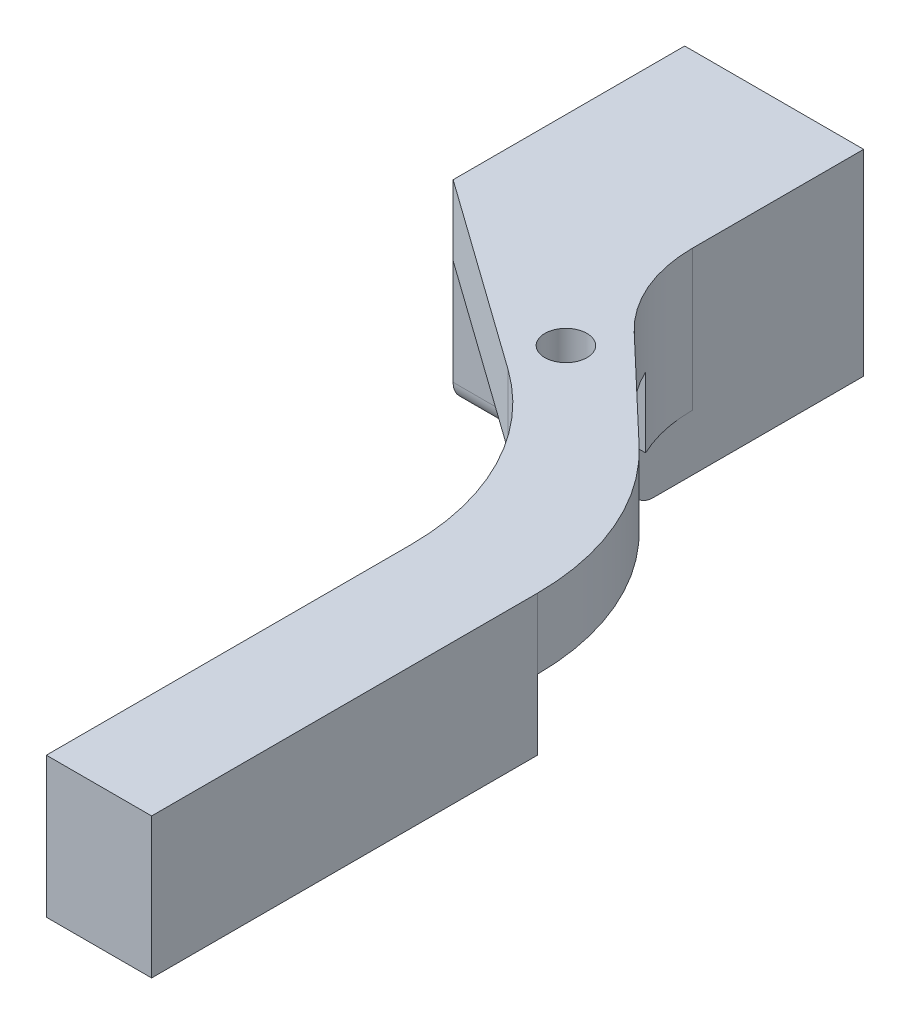
ISO-10303-21;
HEADER;
FILE_DESCRIPTION(('STEP AP214'),'2;1');
FILE_NAME('part.step','',(''),(''),'','','');
FILE_SCHEMA(('AUTOMOTIVE_DESIGN { 1 0 10303 214 1 1 1 1 }'));
ENDSEC;
DATA;
#1=APPLICATION_CONTEXT('core data for automotive mechanical design processes');
#2=APPLICATION_PROTOCOL_DEFINITION('international standard','automotive_design',2000,#1);
#3=PRODUCT_CONTEXT('',#1,'mechanical');
#4=PRODUCT('Part','Part','',(#3));
#5=PRODUCT_RELATED_PRODUCT_CATEGORY('part','',(#4));
#6=PRODUCT_DEFINITION_FORMATION('','',#4);
#7=PRODUCT_DEFINITION_CONTEXT('part definition',#1,'design');
#8=PRODUCT_DEFINITION('design','',#6,#7);
#9=PRODUCT_DEFINITION_SHAPE('','',#8);
#10=(LENGTH_UNIT() NAMED_UNIT(*) SI_UNIT(.MILLI.,.METRE.));
#11=(NAMED_UNIT(*) PLANE_ANGLE_UNIT() SI_UNIT($,.RADIAN.));
#12=(NAMED_UNIT(*) SI_UNIT($,.STERADIAN.) SOLID_ANGLE_UNIT());
#13=UNCERTAINTY_MEASURE_WITH_UNIT(LENGTH_MEASURE(1.E-05),#10,'distance_accuracy_value','');
#14=(GEOMETRIC_REPRESENTATION_CONTEXT(3) GLOBAL_UNCERTAINTY_ASSIGNED_CONTEXT((#13)) GLOBAL_UNIT_ASSIGNED_CONTEXT((#10,
#11,#12)) REPRESENTATION_CONTEXT('',''));
#15=CARTESIAN_POINT('',(0.,0.,0.));
#16=DIRECTION('',(0.,0.,1.));
#17=DIRECTION('',(1.,0.,0.));
#18=AXIS2_PLACEMENT_3D('',#15,#16,#17);
#19=CARTESIAN_POINT('',(0.,-6.,0.));
#20=DIRECTION('',(0.,1.,0.));
#21=DIRECTION('',(0.,0.,1.));
#22=AXIS2_PLACEMENT_3D('',#19,#20,#21);
#23=PLANE('',#22);
#24=CARTESIAN_POINT('',(-9.21544700565424,-6.,81.0202352893997));
#25=DIRECTION('',(0.,1.,0.));
#26=DIRECTION('',(0.,0.,1.));
#27=AXIS2_PLACEMENT_3D('',#24,#25,#26);
#28=CIRCLE('',#27,35.);
#29=CARTESIAN_POINT('',(25.7845529943458,-6.,81.0202352893997));
#30=VERTEX_POINT('',#29);
#31=CARTESIAN_POINT('',(25.6549783249145,-6.,78.0113422595251));
#32=VERTEX_POINT('',#31);
#33=EDGE_CURVE('E324',#30,#32,#28,.T.);
#34=ORIENTED_EDGE('',*,*,#33,.T.);
#35=DIRECTION('',(-1.,0.,0.));
#36=VECTOR('',#35,1.);
#37=CARTESIAN_POINT('',(-16.25,-6.,78.0113422595251));
#38=LINE('',#37,#36);
#39=CARTESIAN_POINT('',(40.7845529943458,-6.,78.0113422595251));
#40=VERTEX_POINT('',#39);
#41=EDGE_CURVE('E209',#40,#32,#38,.T.);
#42=ORIENTED_EDGE('',*,*,#41,.F.);
#43=DIRECTION('',(0.,0.,-1.));
#44=VECTOR('',#43,1.);
#45=CARTESIAN_POINT('',(40.7845529943458,-6.,133.));
#46=LINE('',#45,#44);
#47=CARTESIAN_POINT('',(40.7845529943458,-6.,133.));
#48=VERTEX_POINT('',#47);
#49=EDGE_CURVE('E371',#48,#40,#46,.T.);
#50=ORIENTED_EDGE('',*,*,#49,.F.);
#51=DIRECTION('',(1.,0.,0.));
#52=VECTOR('',#51,1.);
#53=CARTESIAN_POINT('',(25.7845529943458,-6.,133.));
#54=LINE('',#53,#52);
#55=CARTESIAN_POINT('',(25.7845529943458,-6.,133.));
#56=VERTEX_POINT('',#55);
#57=EDGE_CURVE('E394',#56,#48,#54,.T.);
#58=ORIENTED_EDGE('',*,*,#57,.F.);
#59=DIRECTION('',(0.,0.,1.));
#60=VECTOR('',#59,1.);
#61=CARTESIAN_POINT('',(25.7845529943458,-6.,63.));
#62=LINE('',#61,#60);
#63=EDGE_CURVE('E377',#30,#56,#62,.T.);
#64=ORIENTED_EDGE('',*,*,#63,.F.);
#65=EDGE_LOOP('',(#34,#42,#50,#58,#64));
#66=FACE_BOUND('',#65,.T.);
#67=ADVANCED_FACE('F38',(#66),#23,.F.);
#68=CARTESIAN_POINT('',(0.,0.,0.));
#69=DIRECTION('',(0.,0.,-1.));
#70=DIRECTION('',(-1.,0.,0.));
#71=AXIS2_PLACEMENT_3D('',#68,#69,#70);
#72=PLANE('',#71);
#73=DIRECTION('',(0.,1.,0.));
#74=VECTOR('',#73,1.);
#75=CARTESIAN_POINT('',(9.25,-14.,0.));
#76=LINE('',#75,#74);
#77=CARTESIAN_POINT('',(9.25,-14.,0.));
#78=VERTEX_POINT('',#77);
#79=CARTESIAN_POINT('',(9.25,14.,0.));
#80=VERTEX_POINT('',#79);
#81=EDGE_CURVE('E265',#78,#80,#76,.T.);
#82=ORIENTED_EDGE('',*,*,#81,.F.);
#83=DIRECTION('',(1.,0.,0.));
#84=VECTOR('',#83,1.);
#85=CARTESIAN_POINT('',(-16.25,-14.,0.));
#86=LINE('',#85,#84);
#87=CARTESIAN_POINT('',(-16.25,-14.,0.));
#88=VERTEX_POINT('',#87);
#89=EDGE_CURVE('E276',#88,#78,#86,.T.);
#90=ORIENTED_EDGE('',*,*,#89,.F.);
#91=DIRECTION('',(0.,-1.,0.));
#92=VECTOR('',#91,1.);
#93=CARTESIAN_POINT('',(-16.25,-14.,0.));
#94=LINE('',#93,#92);
#95=CARTESIAN_POINT('',(-16.25,14.,0.));
#96=VERTEX_POINT('',#95);
#97=EDGE_CURVE('E272',#96,#88,#94,.T.);
#98=ORIENTED_EDGE('',*,*,#97,.F.);
#99=DIRECTION('',(-1.,0.,0.));
#100=VECTOR('',#99,1.);
#101=CARTESIAN_POINT('',(-16.25,14.,0.));
#102=LINE('',#101,#100);
#103=EDGE_CURVE('E269',#80,#96,#102,.T.);
#104=ORIENTED_EDGE('',*,*,#103,.F.);
#105=EDGE_LOOP('',(#82,#90,#98,#104));
#106=FACE_BOUND('',#105,.T.);
#107=DIRECTION('',(1.,0.,0.));
#108=VECTOR('',#107,1.);
#109=CARTESIAN_POINT('',(-6.25,-11.3,0.));
#110=LINE('',#109,#108);
#111=CARTESIAN_POINT('',(-6.25,-11.3,0.));
#112=VERTEX_POINT('',#111);
#113=CARTESIAN_POINT('',(6.25,-11.3,0.));
#114=VERTEX_POINT('',#113);
#115=EDGE_CURVE('E229',#112,#114,#110,.T.);
#116=ORIENTED_EDGE('',*,*,#115,.T.);
#117=DIRECTION('',(0.,1.,0.));
#118=VECTOR('',#117,1.);
#119=CARTESIAN_POINT('',(6.25,-11.3,0.));
#120=LINE('',#119,#118);
#121=CARTESIAN_POINT('',(6.25,11.3,0.));
#122=VERTEX_POINT('',#121);
#123=EDGE_CURVE('E216',#114,#122,#120,.T.);
#124=ORIENTED_EDGE('',*,*,#123,.T.);
#125=DIRECTION('',(-1.,0.,0.));
#126=VECTOR('',#125,1.);
#127=CARTESIAN_POINT('',(-6.25,11.3,0.));
#128=LINE('',#127,#126);
#129=CARTESIAN_POINT('',(-6.25,11.3,0.));
#130=VERTEX_POINT('',#129);
#131=EDGE_CURVE('E219',#122,#130,#128,.T.);
#132=ORIENTED_EDGE('',*,*,#131,.T.);
#133=DIRECTION('',(0.,-1.,0.));
#134=VECTOR('',#133,1.);
#135=CARTESIAN_POINT('',(-6.25,-11.3,0.));
#136=LINE('',#135,#134);
#137=EDGE_CURVE('E245',#130,#112,#136,.T.);
#138=ORIENTED_EDGE('',*,*,#137,.T.);
#139=EDGE_LOOP('',(#116,#124,#132,#138));
#140=FACE_BOUND('',#139,.T.);
#141=ADVANCED_FACE('F432',(#106,#140),#72,.T.);
#142=CARTESIAN_POINT('',(9.25,-14.,30.));
#143=DIRECTION('',(-1.,0.,0.));
#144=DIRECTION('',(0.,0.,1.));
#145=AXIS2_PLACEMENT_3D('',#142,#143,#144);
#146=PLANE('',#145);
#147=DIRECTION('',(0.,0.,-1.));
#148=VECTOR('',#147,1.);
#149=CARTESIAN_POINT('',(9.25,14.,30.));
#150=LINE('',#149,#148);
#151=CARTESIAN_POINT('',(9.25,14.,24.4220901374142));
#152=VERTEX_POINT('',#151);
#153=EDGE_CURVE('E289',#152,#80,#150,.T.);
#154=ORIENTED_EDGE('',*,*,#153,.F.);
#155=DIRECTION('',(0.,1.,0.));
#156=VECTOR('',#155,1.);
#157=CARTESIAN_POINT('',(9.25,-14.,24.4220901374142));
#158=LINE('',#157,#156);
#159=CARTESIAN_POINT('',(9.25,-6.,24.4220901374142));
#160=VERTEX_POINT('',#159);
#161=EDGE_CURVE('E333',#152,#160,#158,.F.);
#162=ORIENTED_EDGE('',*,*,#161,.T.);
#163=DIRECTION('',(0.,0.,1.));
#164=VECTOR('',#163,1.);
#165=CARTESIAN_POINT('',(9.25,-6.,0.));
#166=LINE('',#165,#164);
#167=CARTESIAN_POINT('',(9.25,-6.,33.));
#168=VERTEX_POINT('',#167);
#169=EDGE_CURVE('E62',#160,#168,#166,.T.);
#170=ORIENTED_EDGE('',*,*,#169,.T.);
#171=DIRECTION('',(0.,1.,0.));
#172=VECTOR('',#171,1.);
#173=CARTESIAN_POINT('',(9.25,14.,33.));
#174=LINE('',#173,#172);
#175=CARTESIAN_POINT('',(9.25,-11.,33.));
#176=VERTEX_POINT('',#175);
#177=EDGE_CURVE('E190',#176,#168,#174,.T.);
#178=ORIENTED_EDGE('',*,*,#177,.F.);
#179=CARTESIAN_POINT('',(9.25,-11.,30.));
#180=DIRECTION('',(-1.,0.,0.));
#181=DIRECTION('',(0.,0.,1.));
#182=AXIS2_PLACEMENT_3D('',#179,#180,#181);
#183=CIRCLE('',#182,3.);
#184=CARTESIAN_POINT('',(9.25,-14.,30.));
#185=VERTEX_POINT('',#184);
#186=EDGE_CURVE('E295',#176,#185,#183,.F.);
#187=ORIENTED_EDGE('',*,*,#186,.T.);
#188=DIRECTION('',(0.,0.,-1.));
#189=VECTOR('',#188,1.);
#190=CARTESIAN_POINT('',(9.25,-14.,30.));
#191=LINE('',#190,#189);
#192=EDGE_CURVE('E280',#185,#78,#191,.T.);
#193=ORIENTED_EDGE('',*,*,#192,.T.);
#194=ORIENTED_EDGE('',*,*,#81,.T.);
#195=EDGE_LOOP('',(#154,#162,#170,#178,#187,#193,#194));
#196=FACE_BOUND('',#195,.T.);
#197=ADVANCED_FACE('F359',(#196),#146,.F.);
#198=CARTESIAN_POINT('',(-16.25,14.,30.));
#199=DIRECTION('',(0.,-1.,0.));
#200=DIRECTION('',(0.,0.,-1.));
#201=AXIS2_PLACEMENT_3D('',#198,#199,#200);
#202=PLANE('',#201);
#203=CARTESIAN_POINT('',(12.25,14.,45.4260665059655));
#204=DIRECTION('',(0.,1.,0.));
#205=DIRECTION('',(0.,0.,1.));
#206=AXIS2_PLACEMENT_3D('',#203,#204,#205);
#207=CIRCLE('',#206,3.);
#208=CARTESIAN_POINT('',(12.25,14.,48.4260665059655));
#209=VERTEX_POINT('',#208);
#210=EDGE_CURVE('E202',#209,#209,#207,.T.);
#211=ORIENTED_EDGE('',*,*,#210,.F.);
#212=EDGE_LOOP('',(#211));
#213=FACE_BOUND('',#212,.T.);
#214=DIRECTION('',(0.,0.,-1.));
#215=VECTOR('',#214,1.);
#216=CARTESIAN_POINT('',(40.7845529943458,14.,133.));
#217=LINE('',#216,#215);
#218=CARTESIAN_POINT('',(40.7845529943458,14.,133.));
#219=VERTEX_POINT('',#218);
#220=CARTESIAN_POINT('',(40.7845529943458,14.,78.0113422595251));
#221=VERTEX_POINT('',#220);
#222=EDGE_CURVE('E378',#219,#221,#217,.T.);
#223=ORIENTED_EDGE('',*,*,#222,.T.);
#224=CARTESIAN_POINT('',(5.78455299434576,14.,78.0113422595251));
#225=DIRECTION('',(0.,-1.,0.));
#226=DIRECTION('',(0.,0.,-1.));
#227=AXIS2_PLACEMENT_3D('',#224,#225,#226);
#228=CIRCLE('',#227,35.);
#229=CARTESIAN_POINT('',(29.9086042935572,14.,52.6533031217484));
#230=VERTEX_POINT('',#229);
#231=EDGE_CURVE('E308',#221,#230,#228,.F.);
#232=ORIENTED_EDGE('',*,*,#231,.T.);
#233=DIRECTION('',(-0.724515403936476,0.,-0.689258608548899));
#234=VECTOR('',#233,1.);
#235=CARTESIAN_POINT('',(9.25,14.,33.));
#236=LINE('',#235,#234);
#237=CARTESIAN_POINT('',(15.464827829022,14.,38.9123982161438));
#238=VERTEX_POINT('',#237);
#239=EDGE_CURVE('E373',#230,#238,#236,.T.);
#240=ORIENTED_EDGE('',*,*,#239,.T.);
#241=CARTESIAN_POINT('',(29.25,14.,24.4220901374142));
#242=DIRECTION('',(0.,-1.,0.));
#243=DIRECTION('',(0.,0.,-1.));
#244=AXIS2_PLACEMENT_3D('',#241,#242,#243);
#245=CIRCLE('',#244,20.);
#246=EDGE_CURVE('E336',#238,#152,#245,.T.);
#247=ORIENTED_EDGE('',*,*,#246,.T.);
#248=ORIENTED_EDGE('',*,*,#153,.T.);
#249=ORIENTED_EDGE('',*,*,#103,.T.);
#250=DIRECTION('',(0.,0.,-1.));
#251=VECTOR('',#250,1.);
#252=CARTESIAN_POINT('',(-16.25,14.,30.));
#253=LINE('',#252,#251);
#254=CARTESIAN_POINT('',(-16.25,14.,33.));
#255=VERTEX_POINT('',#254);
#256=EDGE_CURVE('E286',#255,#96,#253,.T.);
#257=ORIENTED_EDGE('',*,*,#256,.F.);
#258=DIRECTION('',(0.813959452282594,0.,0.580921690109622));
#259=VECTOR('',#258,1.);
#260=CARTESIAN_POINT('',(-16.25,14.,33.));
#261=LINE('',#260,#259);
#262=CARTESIAN_POINT('',(11.1168121481825,14.,52.5316544595089));
#263=VERTEX_POINT('',#262);
#264=EDGE_CURVE('E213',#255,#263,#261,.T.);
#265=ORIENTED_EDGE('',*,*,#264,.T.);
#266=CARTESIAN_POINT('',(-9.21544700565424,14.,81.0202352893997));
#267=DIRECTION('',(0.,-1.,0.));
#268=DIRECTION('',(0.,0.,-1.));
#269=AXIS2_PLACEMENT_3D('',#266,#267,#268);
#270=CIRCLE('',#269,35.);
#271=CARTESIAN_POINT('',(25.7845529943458,14.,81.0202352893997));
#272=VERTEX_POINT('',#271);
#273=EDGE_CURVE('E321',#263,#272,#270,.T.);
#274=ORIENTED_EDGE('',*,*,#273,.T.);
#275=DIRECTION('',(0.,0.,1.));
#276=VECTOR('',#275,1.);
#277=CARTESIAN_POINT('',(25.7845529943458,14.,63.));
#278=LINE('',#277,#276);
#279=CARTESIAN_POINT('',(25.7845529943458,14.,133.));
#280=VERTEX_POINT('',#279);
#281=EDGE_CURVE('E386',#272,#280,#278,.T.);
#282=ORIENTED_EDGE('',*,*,#281,.T.);
#283=DIRECTION('',(1.,0.,0.));
#284=VECTOR('',#283,1.);
#285=CARTESIAN_POINT('',(25.7845529943458,14.,133.));
#286=LINE('',#285,#284);
#287=EDGE_CURVE('E382',#280,#219,#286,.T.);
#288=ORIENTED_EDGE('',*,*,#287,.T.);
#289=EDGE_LOOP('',(#223,#232,#240,#247,#248,#249,#257,#265,#274,#282,#288));
#290=FACE_BOUND('',#289,.T.);
#291=ADVANCED_FACE('F426',(#213,#290),#202,.F.);
#292=CARTESIAN_POINT('',(-16.25,-14.,30.));
#293=DIRECTION('',(1.,0.,0.));
#294=DIRECTION('',(0.,0.,-1.));
#295=AXIS2_PLACEMENT_3D('',#292,#293,#294);
#296=PLANE('',#295);
#297=DIRECTION('',(0.,0.,-1.));
#298=VECTOR('',#297,1.);
#299=CARTESIAN_POINT('',(-16.25,-14.,30.));
#300=LINE('',#299,#298);
#301=CARTESIAN_POINT('',(-16.25,-14.,30.));
#302=VERTEX_POINT('',#301);
#303=EDGE_CURVE('E283',#302,#88,#300,.T.);
#304=ORIENTED_EDGE('',*,*,#303,.F.);
#305=CARTESIAN_POINT('',(-16.25,-11.,30.));
#306=DIRECTION('',(1.,0.,0.));
#307=DIRECTION('',(0.,0.,-1.));
#308=AXIS2_PLACEMENT_3D('',#305,#306,#307);
#309=CIRCLE('',#308,3.);
#310=CARTESIAN_POINT('',(-16.25,-11.,33.));
#311=VERTEX_POINT('',#310);
#312=EDGE_CURVE('E185',#302,#311,#309,.F.);
#313=ORIENTED_EDGE('',*,*,#312,.T.);
#314=DIRECTION('',(0.,-1.,0.));
#315=VECTOR('',#314,1.);
#316=CARTESIAN_POINT('',(-16.25,14.,33.));
#317=LINE('',#316,#315);
#318=CARTESIAN_POINT('',(-16.25,4.,33.));
#319=VERTEX_POINT('',#318);
#320=EDGE_CURVE('E178',#319,#311,#317,.T.);
#321=ORIENTED_EDGE('',*,*,#320,.F.);
#322=EDGE_CURVE('E183',#255,#319,#317,.T.);
#323=ORIENTED_EDGE('',*,*,#322,.F.);
#324=ORIENTED_EDGE('',*,*,#256,.T.);
#325=ORIENTED_EDGE('',*,*,#97,.T.);
#326=EDGE_LOOP('',(#304,#313,#321,#323,#324,#325));
#327=FACE_BOUND('',#326,.T.);
#328=ADVANCED_FACE('F180',(#327),#296,.F.);
#329=CARTESIAN_POINT('',(-16.25,-14.,30.));
#330=DIRECTION('',(0.,1.,0.));
#331=DIRECTION('',(0.,0.,1.));
#332=AXIS2_PLACEMENT_3D('',#329,#330,#331);
#333=PLANE('',#332);
#334=ORIENTED_EDGE('',*,*,#192,.F.);
#335=DIRECTION('',(1.,0.,0.));
#336=VECTOR('',#335,1.);
#337=CARTESIAN_POINT('',(-16.25,-14.,30.));
#338=LINE('',#337,#336);
#339=EDGE_CURVE('E298',#185,#302,#338,.F.);
#340=ORIENTED_EDGE('',*,*,#339,.T.);
#341=ORIENTED_EDGE('',*,*,#303,.T.);
#342=ORIENTED_EDGE('',*,*,#89,.T.);
#343=EDGE_LOOP('',(#334,#340,#341,#342));
#344=FACE_BOUND('',#343,.T.);
#345=ADVANCED_FACE('F436',(#344),#333,.F.);
#346=CARTESIAN_POINT('',(6.25,-11.3,30.));
#347=DIRECTION('',(-1.,0.,0.));
#348=DIRECTION('',(0.,0.,1.));
#349=AXIS2_PLACEMENT_3D('',#346,#347,#348);
#350=PLANE('',#349);
#351=ORIENTED_EDGE('',*,*,#123,.F.);
#352=DIRECTION('',(0.,0.,-1.));
#353=VECTOR('',#352,1.);
#354=CARTESIAN_POINT('',(6.25,-11.3,30.));
#355=LINE('',#354,#353);
#356=CARTESIAN_POINT('',(6.25,-11.3,30.));
#357=VERTEX_POINT('',#356);
#358=EDGE_CURVE('E240',#357,#114,#355,.T.);
#359=ORIENTED_EDGE('',*,*,#358,.F.);
#360=DIRECTION('',(0.,1.,0.));
#361=VECTOR('',#360,1.);
#362=CARTESIAN_POINT('',(6.25,-11.3,30.));
#363=LINE('',#362,#361);
#364=CARTESIAN_POINT('',(6.25,11.3,30.));
#365=VERTEX_POINT('',#364);
#366=EDGE_CURVE('E224',#357,#365,#363,.T.);
#367=ORIENTED_EDGE('',*,*,#366,.T.);
#368=DIRECTION('',(0.,0.,-1.));
#369=VECTOR('',#368,1.);
#370=CARTESIAN_POINT('',(6.25,11.3,30.));
#371=LINE('',#370,#369);
#372=EDGE_CURVE('E261',#365,#122,#371,.T.);
#373=ORIENTED_EDGE('',*,*,#372,.T.);
#374=EDGE_LOOP('',(#351,#359,#367,#373));
#375=FACE_BOUND('',#374,.T.);
#376=ADVANCED_FACE('F505',(#375),#350,.T.);
#377=CARTESIAN_POINT('',(-6.25,11.3,30.));
#378=DIRECTION('',(0.,-1.,0.));
#379=DIRECTION('',(0.,0.,-1.));
#380=AXIS2_PLACEMENT_3D('',#377,#378,#379);
#381=PLANE('',#380);
#382=ORIENTED_EDGE('',*,*,#131,.F.);
#383=ORIENTED_EDGE('',*,*,#372,.F.);
#384=DIRECTION('',(-1.,0.,0.));
#385=VECTOR('',#384,1.);
#386=CARTESIAN_POINT('',(-6.25,11.3,30.));
#387=LINE('',#386,#385);
#388=CARTESIAN_POINT('',(-6.25,11.3,30.));
#389=VERTEX_POINT('',#388);
#390=EDGE_CURVE('E228',#365,#389,#387,.T.);
#391=ORIENTED_EDGE('',*,*,#390,.T.);
#392=DIRECTION('',(0.,0.,-1.));
#393=VECTOR('',#392,1.);
#394=CARTESIAN_POINT('',(-6.25,11.3,30.));
#395=LINE('',#394,#393);
#396=EDGE_CURVE('E258',#389,#130,#395,.T.);
#397=ORIENTED_EDGE('',*,*,#396,.T.);
#398=EDGE_LOOP('',(#382,#383,#391,#397));
#399=FACE_BOUND('',#398,.T.);
#400=ADVANCED_FACE('F501',(#399),#381,.T.);
#401=CARTESIAN_POINT('',(-6.25,-11.3,30.));
#402=DIRECTION('',(1.,0.,0.));
#403=DIRECTION('',(0.,0.,-1.));
#404=AXIS2_PLACEMENT_3D('',#401,#402,#403);
#405=PLANE('',#404);
#406=ORIENTED_EDGE('',*,*,#137,.F.);
#407=ORIENTED_EDGE('',*,*,#396,.F.);
#408=DIRECTION('',(0.,-1.,0.));
#409=VECTOR('',#408,1.);
#410=CARTESIAN_POINT('',(-6.25,-11.3,30.));
#411=LINE('',#410,#409);
#412=CARTESIAN_POINT('',(-6.25,-11.3,30.));
#413=VERTEX_POINT('',#412);
#414=EDGE_CURVE('E233',#389,#413,#411,.T.);
#415=ORIENTED_EDGE('',*,*,#414,.T.);
#416=DIRECTION('',(0.,0.,-1.));
#417=VECTOR('',#416,1.);
#418=CARTESIAN_POINT('',(-6.25,-11.3,30.));
#419=LINE('',#418,#417);
#420=EDGE_CURVE('E255',#413,#112,#419,.T.);
#421=ORIENTED_EDGE('',*,*,#420,.T.);
#422=EDGE_LOOP('',(#406,#407,#415,#421));
#423=FACE_BOUND('',#422,.T.);
#424=ADVANCED_FACE('F497',(#423),#405,.T.);
#425=CARTESIAN_POINT('',(-6.25,-11.3,30.));
#426=DIRECTION('',(0.,1.,0.));
#427=DIRECTION('',(0.,0.,1.));
#428=AXIS2_PLACEMENT_3D('',#425,#426,#427);
#429=PLANE('',#428);
#430=ORIENTED_EDGE('',*,*,#115,.F.);
#431=ORIENTED_EDGE('',*,*,#420,.F.);
#432=DIRECTION('',(1.,0.,0.));
#433=VECTOR('',#432,1.);
#434=CARTESIAN_POINT('',(-6.25,-11.3,30.));
#435=LINE('',#434,#433);
#436=EDGE_CURVE('E237',#413,#357,#435,.T.);
#437=ORIENTED_EDGE('',*,*,#436,.T.);
#438=ORIENTED_EDGE('',*,*,#358,.T.);
#439=EDGE_LOOP('',(#430,#431,#437,#438));
#440=FACE_BOUND('',#439,.T.);
#441=ADVANCED_FACE('F493',(#440),#429,.T.);
#442=CARTESIAN_POINT('',(0.,0.,30.));
#443=DIRECTION('',(0.,0.,-1.));
#444=DIRECTION('',(-1.,0.,0.));
#445=AXIS2_PLACEMENT_3D('',#442,#443,#444);
#446=PLANE('',#445);
#447=ORIENTED_EDGE('',*,*,#366,.F.);
#448=ORIENTED_EDGE('',*,*,#436,.F.);
#449=ORIENTED_EDGE('',*,*,#414,.F.);
#450=ORIENTED_EDGE('',*,*,#390,.F.);
#451=EDGE_LOOP('',(#447,#448,#449,#450));
#452=FACE_BOUND('',#451,.T.);
#453=ADVANCED_FACE('F490',(#452),#446,.T.);
#454=CARTESIAN_POINT('',(0.,0.,33.));
#455=DIRECTION('',(0.,0.,-1.));
#456=DIRECTION('',(-1.,0.,0.));
#457=AXIS2_PLACEMENT_3D('',#454,#455,#456);
#458=PLANE('',#457);
#459=ORIENTED_EDGE('',*,*,#320,.T.);
#460=DIRECTION('',(1.,0.,0.));
#461=VECTOR('',#460,1.);
#462=CARTESIAN_POINT('',(0.,-11.,33.));
#463=LINE('',#462,#461);
#464=EDGE_CURVE('E292',#311,#176,#463,.T.);
#465=ORIENTED_EDGE('',*,*,#464,.T.);
#466=ORIENTED_EDGE('',*,*,#177,.T.);
#467=DIRECTION('',(1.,0.,0.));
#468=VECTOR('',#467,1.);
#469=CARTESIAN_POINT('',(-16.25,-6.,33.));
#470=LINE('',#469,#468);
#471=CARTESIAN_POINT('',(11.1829177123324,-6.,33.));
#472=VERTEX_POINT('',#471);
#473=EDGE_CURVE('E352',#168,#472,#470,.T.);
#474=ORIENTED_EDGE('',*,*,#473,.T.);
#475=DIRECTION('',(0.,1.,0.));
#476=VECTOR('',#475,1.);
#477=CARTESIAN_POINT('',(11.1829177123324,-6.,33.));
#478=LINE('',#477,#476);
#479=CARTESIAN_POINT('',(11.1829177123324,4.,33.));
#480=VERTEX_POINT('',#479);
#481=EDGE_CURVE('E47',#480,#472,#478,.F.);
#482=ORIENTED_EDGE('',*,*,#481,.F.);
#483=DIRECTION('',(1.,0.,0.));
#484=VECTOR('',#483,1.);
#485=CARTESIAN_POINT('',(-16.25,4.,33.));
#486=LINE('',#485,#484);
#487=EDGE_CURVE('E54',#319,#480,#486,.T.);
#488=ORIENTED_EDGE('',*,*,#487,.F.);
#489=EDGE_LOOP('',(#459,#465,#466,#474,#482,#488));
#490=FACE_BOUND('',#489,.T.);
#491=ADVANCED_FACE('F204',(#490),#458,.F.);
#492=CARTESIAN_POINT('',(9.25,-6.,33.));
#493=DIRECTION('',(0.689258608548899,0.,-0.724515403936476));
#494=DIRECTION('',(-0.724515403936476,0.,-0.689258608548899));
#495=AXIS2_PLACEMENT_3D('',#492,#493,#494);
#496=PLANE('',#495);
#497=DIRECTION('',(0.724515403936476,0.,0.689258608548899));
#498=VECTOR('',#497,1.);
#499=CARTESIAN_POINT('',(9.25,4.,33.));
#500=LINE('',#499,#498);
#501=CARTESIAN_POINT('',(15.464827829022,4.,38.9123982161438));
#502=VERTEX_POINT('',#501);
#503=CARTESIAN_POINT('',(29.9086042935573,4.,52.6533031217484));
#504=VERTEX_POINT('',#503);
#505=EDGE_CURVE('E407',#502,#504,#500,.T.);
#506=ORIENTED_EDGE('',*,*,#505,.F.);
#507=DIRECTION('',(0.,1.,0.));
#508=VECTOR('',#507,1.);
#509=CARTESIAN_POINT('',(15.464827829022,-6.,38.9123982161438));
#510=LINE('',#509,#508);
#511=EDGE_CURVE('E328',#502,#238,#510,.T.);
#512=ORIENTED_EDGE('',*,*,#511,.T.);
#513=ORIENTED_EDGE('',*,*,#239,.F.);
#514=DIRECTION('',(0.,1.,0.));
#515=VECTOR('',#514,1.);
#516=CARTESIAN_POINT('',(29.9086042935572,-6.,52.6533031217484));
#517=LINE('',#516,#515);
#518=EDGE_CURVE('E311',#230,#504,#517,.F.);
#519=ORIENTED_EDGE('',*,*,#518,.T.);
#520=EDGE_LOOP('',(#506,#512,#513,#519));
#521=FACE_BOUND('',#520,.T.);
#522=ADVANCED_FACE('F446',(#521),#496,.T.);
#523=CARTESIAN_POINT('',(40.7845529943458,-6.,133.));
#524=DIRECTION('',(1.,0.,0.));
#525=DIRECTION('',(0.,0.,-1.));
#526=AXIS2_PLACEMENT_3D('',#523,#524,#525);
#527=PLANE('',#526);
#528=ORIENTED_EDGE('',*,*,#49,.T.);
#529=DIRECTION('',(0.,1.,0.));
#530=VECTOR('',#529,1.);
#531=CARTESIAN_POINT('',(40.7845529943458,-6.,78.0113422595251));
#532=LINE('',#531,#530);
#533=CARTESIAN_POINT('',(40.7845529943458,4.,78.0113422595251));
#534=VERTEX_POINT('',#533);
#535=EDGE_CURVE('E304',#40,#534,#532,.T.);
#536=ORIENTED_EDGE('',*,*,#535,.T.);
#537=EDGE_CURVE('E303',#534,#221,#532,.T.);
#538=ORIENTED_EDGE('',*,*,#537,.T.);
#539=ORIENTED_EDGE('',*,*,#222,.F.);
#540=DIRECTION('',(0.,1.,0.));
#541=VECTOR('',#540,1.);
#542=CARTESIAN_POINT('',(40.7845529943458,-6.,133.));
#543=LINE('',#542,#541);
#544=EDGE_CURVE('E361',#48,#219,#543,.T.);
#545=ORIENTED_EDGE('',*,*,#544,.F.);
#546=EDGE_LOOP('',(#528,#536,#538,#539,#545));
#547=FACE_BOUND('',#546,.T.);
#548=ADVANCED_FACE('F451',(#547),#527,.T.);
#549=CARTESIAN_POINT('',(25.7845529943458,-6.,133.));
#550=DIRECTION('',(0.,0.,1.));
#551=DIRECTION('',(1.,0.,0.));
#552=AXIS2_PLACEMENT_3D('',#549,#550,#551);
#553=PLANE('',#552);
#554=ORIENTED_EDGE('',*,*,#287,.F.);
#555=DIRECTION('',(0.,1.,0.));
#556=VECTOR('',#555,1.);
#557=CARTESIAN_POINT('',(25.7845529943458,-6.,133.));
#558=LINE('',#557,#556);
#559=EDGE_CURVE('E363',#56,#280,#558,.T.);
#560=ORIENTED_EDGE('',*,*,#559,.F.);
#561=ORIENTED_EDGE('',*,*,#57,.T.);
#562=ORIENTED_EDGE('',*,*,#544,.T.);
#563=EDGE_LOOP('',(#554,#560,#561,#562));
#564=FACE_BOUND('',#563,.T.);
#565=ADVANCED_FACE('F461',(#564),#553,.T.);
#566=CARTESIAN_POINT('',(25.7845529943458,-6.,63.));
#567=DIRECTION('',(-1.,0.,0.));
#568=DIRECTION('',(0.,0.,1.));
#569=AXIS2_PLACEMENT_3D('',#566,#567,#568);
#570=PLANE('',#569);
#571=ORIENTED_EDGE('',*,*,#281,.F.);
#572=DIRECTION('',(0.,1.,0.));
#573=VECTOR('',#572,1.);
#574=CARTESIAN_POINT('',(25.7845529943458,-6.,81.0202352893997));
#575=LINE('',#574,#573);
#576=EDGE_CURVE('E318',#272,#30,#575,.F.);
#577=ORIENTED_EDGE('',*,*,#576,.T.);
#578=ORIENTED_EDGE('',*,*,#63,.T.);
#579=ORIENTED_EDGE('',*,*,#559,.T.);
#580=EDGE_LOOP('',(#571,#577,#578,#579));
#581=FACE_BOUND('',#580,.T.);
#582=ADVANCED_FACE('F460',(#581),#570,.T.);
#583=CARTESIAN_POINT('',(-16.25,-6.,33.));
#584=DIRECTION('',(-0.580921690109622,0.,0.813959452282594));
#585=DIRECTION('',(0.813959452282594,0.,0.580921690109622));
#586=AXIS2_PLACEMENT_3D('',#583,#584,#585);
#587=PLANE('',#586);
#588=DIRECTION('',(-0.813959452282594,0.,-0.580921690109622));
#589=VECTOR('',#588,1.);
#590=CARTESIAN_POINT('',(-16.25,4.,33.));
#591=LINE('',#590,#589);
#592=CARTESIAN_POINT('',(11.1168121481825,4.,52.5316544595089));
#593=VERTEX_POINT('',#592);
#594=EDGE_CURVE('E193',#593,#319,#591,.T.);
#595=ORIENTED_EDGE('',*,*,#594,.F.);
#596=DIRECTION('',(0.,1.,0.));
#597=VECTOR('',#596,1.);
#598=CARTESIAN_POINT('',(11.1168121481825,14.,52.5316544595089));
#599=LINE('',#598,#597);
#600=EDGE_CURVE('E315',#593,#263,#599,.T.);
#601=ORIENTED_EDGE('',*,*,#600,.T.);
#602=ORIENTED_EDGE('',*,*,#264,.F.);
#603=ORIENTED_EDGE('',*,*,#322,.T.);
#604=EDGE_LOOP('',(#595,#601,#602,#603));
#605=FACE_BOUND('',#604,.T.);
#606=ADVANCED_FACE('F211',(#605),#587,.T.);
#607=CARTESIAN_POINT('',(29.25,-6.,24.4220901374142));
#608=DIRECTION('',(0.,1.,0.));
#609=DIRECTION('',(0.,0.,1.));
#610=AXIS2_PLACEMENT_3D('',#607,#608,#609);
#611=CIRCLE('',#610,20.);
#612=EDGE_CURVE('E339',#160,#472,#611,.T.);
#613=ORIENTED_EDGE('',*,*,#612,.T.);
#614=ORIENTED_EDGE('',*,*,#473,.F.);
#615=ORIENTED_EDGE('',*,*,#169,.F.);
#616=EDGE_LOOP('',(#613,#614,#615));
#617=FACE_BOUND('',#616,.T.);
#618=ADVANCED_FACE('F351',(#617),#23,.F.);
#619=CARTESIAN_POINT('',(0.,-11.,30.));
#620=DIRECTION('',(1.,0.,0.));
#621=DIRECTION('',(0.,0.,-1.));
#622=AXIS2_PLACEMENT_3D('',#619,#620,#621);
#623=CYLINDRICAL_SURFACE('',#622,3.);
#624=ORIENTED_EDGE('',*,*,#312,.F.);
#625=ORIENTED_EDGE('',*,*,#339,.F.);
#626=ORIENTED_EDGE('',*,*,#186,.F.);
#627=ORIENTED_EDGE('',*,*,#464,.F.);
#628=EDGE_LOOP('',(#624,#625,#626,#627));
#629=FACE_BOUND('',#628,.T.);
#630=ADVANCED_FACE('F439',(#629),#623,.T.);
#631=CARTESIAN_POINT('',(5.78455299434576,-6.,78.0113422595251));
#632=DIRECTION('',(0.,1.,0.));
#633=DIRECTION('',(0.,0.,1.));
#634=AXIS2_PLACEMENT_3D('',#631,#632,#633);
#635=CYLINDRICAL_SURFACE('',#634,35.);
#636=CARTESIAN_POINT('',(5.78455299434576,4.,78.0113422595251));
#637=DIRECTION('',(0.,1.,0.));
#638=DIRECTION('',(0.,0.,1.));
#639=AXIS2_PLACEMENT_3D('',#636,#637,#638);
#640=CIRCLE('',#639,35.);
#641=EDGE_CURVE('E404',#504,#534,#640,.F.);
#642=ORIENTED_EDGE('',*,*,#641,.F.);
#643=ORIENTED_EDGE('',*,*,#518,.F.);
#644=ORIENTED_EDGE('',*,*,#231,.F.);
#645=ORIENTED_EDGE('',*,*,#537,.F.);
#646=EDGE_LOOP('',(#642,#643,#644,#645));
#647=FACE_BOUND('',#646,.T.);
#648=ADVANCED_FACE('F448',(#647),#635,.T.);
#649=CARTESIAN_POINT('',(-9.21544700565424,-6.,81.0202352893997));
#650=DIRECTION('',(0.,-1.,0.));
#651=DIRECTION('',(0.,0.,-1.));
#652=AXIS2_PLACEMENT_3D('',#649,#650,#651);
#653=CYLINDRICAL_SURFACE('',#652,35.);
#654=CARTESIAN_POINT('',(-9.21544700565424,4.,81.0202352893997));
#655=DIRECTION('',(0.,1.,0.));
#656=DIRECTION('',(0.,0.,1.));
#657=AXIS2_PLACEMENT_3D('',#654,#655,#656);
#658=CIRCLE('',#657,35.);
#659=CARTESIAN_POINT('',(25.6549783249145,4.,78.0113422595251));
#660=VERTEX_POINT('',#659);
#661=EDGE_CURVE('E198',#593,#660,#658,.F.);
#662=ORIENTED_EDGE('',*,*,#661,.T.);
#663=DIRECTION('',(0.,-1.,0.));
#664=VECTOR('',#663,1.);
#665=CARTESIAN_POINT('',(25.6549783249145,-6.,78.0113422595251));
#666=LINE('',#665,#664);
#667=EDGE_CURVE('E11',#660,#32,#666,.T.);
#668=ORIENTED_EDGE('',*,*,#667,.T.);
#669=ORIENTED_EDGE('',*,*,#33,.F.);
#670=ORIENTED_EDGE('',*,*,#576,.F.);
#671=ORIENTED_EDGE('',*,*,#273,.F.);
#672=ORIENTED_EDGE('',*,*,#600,.F.);
#673=EDGE_LOOP('',(#662,#668,#669,#670,#671,#672));
#674=FACE_BOUND('',#673,.T.);
#675=ADVANCED_FACE('F420',(#674),#653,.F.);
#676=CARTESIAN_POINT('',(29.25,-6.,24.4220901374142));
#677=DIRECTION('',(0.,1.,0.));
#678=DIRECTION('',(0.,0.,1.));
#679=AXIS2_PLACEMENT_3D('',#676,#677,#678);
#680=CYLINDRICAL_SURFACE('',#679,20.);
#681=CARTESIAN_POINT('',(29.25,4.,24.4220901374142));
#682=DIRECTION('',(0.,1.,0.));
#683=DIRECTION('',(0.,0.,1.));
#684=AXIS2_PLACEMENT_3D('',#681,#682,#683);
#685=CIRCLE('',#684,20.);
#686=EDGE_CURVE('E345',#502,#480,#685,.F.);
#687=ORIENTED_EDGE('',*,*,#686,.T.);
#688=ORIENTED_EDGE('',*,*,#481,.T.);
#689=ORIENTED_EDGE('',*,*,#612,.F.);
#690=ORIENTED_EDGE('',*,*,#161,.F.);
#691=ORIENTED_EDGE('',*,*,#246,.F.);
#692=ORIENTED_EDGE('',*,*,#511,.F.);
#693=EDGE_LOOP('',(#687,#688,#689,#690,#691,#692));
#694=FACE_BOUND('',#693,.T.);
#695=ADVANCED_FACE('F40',(#694),#680,.F.);
#696=CARTESIAN_POINT('',(12.25,-16.,45.4260665059655));
#697=DIRECTION('',(0.,1.,0.));
#698=DIRECTION('',(0.,0.,1.));
#699=AXIS2_PLACEMENT_3D('',#696,#697,#698);
#700=CYLINDRICAL_SURFACE('',#699,3.);
#701=CARTESIAN_POINT('',(12.25,4.,45.4260665059655));
#702=DIRECTION('',(0.,1.,0.));
#703=DIRECTION('',(0.,0.,1.));
#704=AXIS2_PLACEMENT_3D('',#701,#702,#703);
#705=CIRCLE('',#704,3.);
#706=CARTESIAN_POINT('',(12.25,4.,48.4260665059655));
#707=VERTEX_POINT('',#706);
#708=EDGE_CURVE('E342',#707,#707,#705,.F.);
#709=ORIENTED_EDGE('',*,*,#708,.T.);
#710=EDGE_LOOP('',(#709));
#711=FACE_BOUND('',#710,.T.);
#712=ORIENTED_EDGE('',*,*,#210,.T.);
#713=EDGE_LOOP('',(#712));
#714=FACE_BOUND('',#713,.T.);
#715=ADVANCED_FACE('F524',(#711,#714),#700,.F.);
#716=CARTESIAN_POINT('',(-16.25,4.,78.0113422595251));
#717=DIRECTION('',(0.,0.,1.));
#718=DIRECTION('',(1.,0.,0.));
#719=AXIS2_PLACEMENT_3D('',#716,#717,#718);
#720=PLANE('',#719);
#721=DIRECTION('',(-1.,0.,0.));
#722=VECTOR('',#721,1.);
#723=CARTESIAN_POINT('',(-16.25,4.,78.0113422595251));
#724=LINE('',#723,#722);
#725=EDGE_CURVE('E208',#534,#660,#724,.T.);
#726=ORIENTED_EDGE('',*,*,#725,.F.);
#727=ORIENTED_EDGE('',*,*,#535,.F.);
#728=ORIENTED_EDGE('',*,*,#41,.T.);
#729=ORIENTED_EDGE('',*,*,#667,.F.);
#730=EDGE_LOOP('',(#726,#727,#728,#729));
#731=FACE_BOUND('',#730,.T.);
#732=ADVANCED_FACE('F454',(#731),#720,.F.);
#733=CARTESIAN_POINT('',(0.,4.,0.));
#734=DIRECTION('',(0.,1.,0.));
#735=DIRECTION('',(0.,0.,1.));
#736=AXIS2_PLACEMENT_3D('',#733,#734,#735);
#737=PLANE('',#736);
#738=ORIENTED_EDGE('',*,*,#594,.T.);
#739=ORIENTED_EDGE('',*,*,#487,.T.);
#740=ORIENTED_EDGE('',*,*,#686,.F.);
#741=ORIENTED_EDGE('',*,*,#505,.T.);
#742=ORIENTED_EDGE('',*,*,#641,.T.);
#743=ORIENTED_EDGE('',*,*,#725,.T.);
#744=ORIENTED_EDGE('',*,*,#661,.F.);
#745=EDGE_LOOP('',(#738,#739,#740,#741,#742,#743,#744));
#746=FACE_BOUND('',#745,.T.);
#747=ORIENTED_EDGE('',*,*,#708,.F.);
#748=EDGE_LOOP('',(#747));
#749=FACE_BOUND('',#748,.T.);
#750=ADVANCED_FACE('F194',(#746,#749),#737,.F.);
#751=CLOSED_SHELL('',(#67,#141,#197,#291,#328,#345,#376,#400,#424,#441,#453,#491,#522,#548,#565,
#582,#606,#618,#630,#648,#675,#695,#715,#732,#750));
#752=MANIFOLD_SOLID_BREP('B2',#751);
#753=ADVANCED_BREP_SHAPE_REPRESENTATION('',(#18,#752),#14);
#754=SHAPE_DEFINITION_REPRESENTATION(#9,#753);
ENDSEC;
END-ISO-10303-21;
